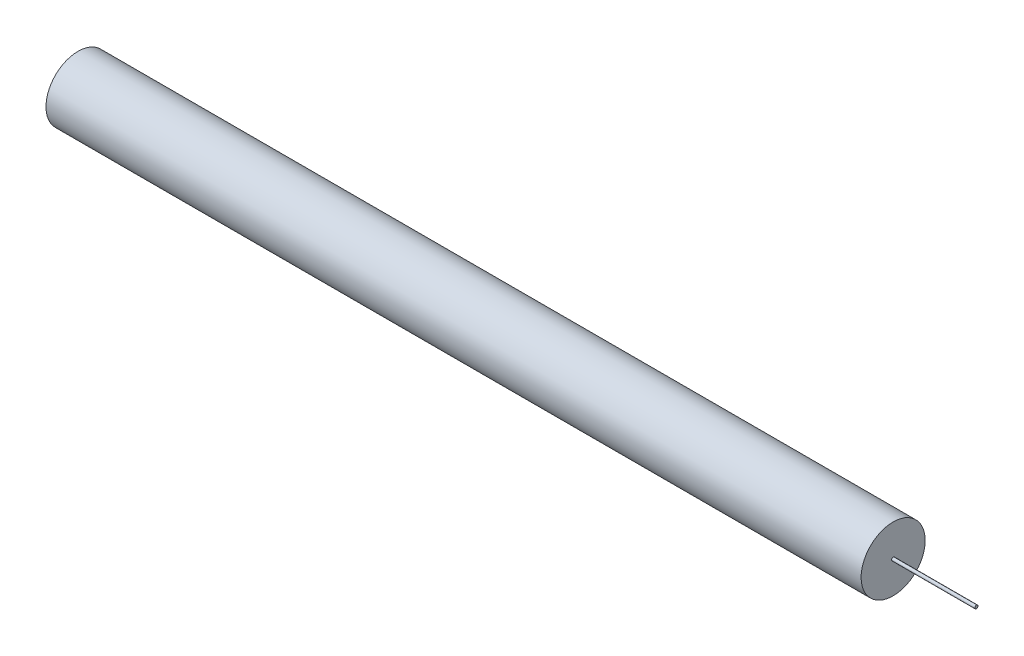
ISO-10303-21;
HEADER;
FILE_DESCRIPTION(('STEP AP214'),'2;1');
FILE_NAME('part.step','',(''),(''),'','','');
FILE_SCHEMA(('AUTOMOTIVE_DESIGN { 1 0 10303 214 1 1 1 1 }'));
ENDSEC;
DATA;
#1=APPLICATION_CONTEXT('core data for automotive mechanical design processes');
#2=APPLICATION_PROTOCOL_DEFINITION('international standard','automotive_design',2000,#1);
#3=PRODUCT_CONTEXT('',#1,'mechanical');
#4=PRODUCT('Part','Part','',(#3));
#5=PRODUCT_RELATED_PRODUCT_CATEGORY('part','',(#4));
#6=PRODUCT_DEFINITION_FORMATION('','',#4);
#7=PRODUCT_DEFINITION_CONTEXT('part definition',#1,'design');
#8=PRODUCT_DEFINITION('design','',#6,#7);
#9=PRODUCT_DEFINITION_SHAPE('','',#8);
#10=(LENGTH_UNIT() NAMED_UNIT(*) SI_UNIT(.MILLI.,.METRE.));
#11=(NAMED_UNIT(*) PLANE_ANGLE_UNIT() SI_UNIT($,.RADIAN.));
#12=(NAMED_UNIT(*) SI_UNIT($,.STERADIAN.) SOLID_ANGLE_UNIT());
#13=UNCERTAINTY_MEASURE_WITH_UNIT(LENGTH_MEASURE(1.E-05),#10,'distance_accuracy_value','');
#14=(GEOMETRIC_REPRESENTATION_CONTEXT(3) GLOBAL_UNCERTAINTY_ASSIGNED_CONTEXT((#13)) GLOBAL_UNIT_ASSIGNED_CONTEXT((#10,
#11,#12)) REPRESENTATION_CONTEXT('',''));
#15=CARTESIAN_POINT('',(0.,0.,0.));
#16=DIRECTION('',(0.,0.,1.));
#17=DIRECTION('',(1.,0.,0.));
#18=AXIS2_PLACEMENT_3D('',#15,#16,#17);
#19=CARTESIAN_POINT('',(0.,0.,0.));
#20=DIRECTION('',(1.,0.,0.));
#21=DIRECTION('',(0.,1.,0.));
#22=AXIS2_PLACEMENT_3D('',#19,#20,#21);
#23=PLANE('',#22);
#24=CARTESIAN_POINT('',(0.,0.,0.));
#25=DIRECTION('',(1.,0.,0.));
#26=DIRECTION('',(0.,1.,0.));
#27=AXIS2_PLACEMENT_3D('',#24,#25,#26);
#28=CIRCLE('',#27,20.);
#29=CARTESIAN_POINT('',(0.,20.,0.));
#30=VERTEX_POINT('',#29);
#31=EDGE_CURVE('E64',#30,#30,#28,.T.);
#32=ORIENTED_EDGE('',*,*,#31,.F.);
#33=EDGE_LOOP('',(#32));
#34=FACE_BOUND('',#33,.T.);
#35=ADVANCED_FACE('F57',(#34),#23,.F.);
#36=CARTESIAN_POINT('',(509.085862196273,0.,0.));
#37=DIRECTION('',(1.,0.,0.));
#38=DIRECTION('',(0.,1.,0.));
#39=AXIS2_PLACEMENT_3D('',#36,#37,#38);
#40=PLANE('',#39);
#41=CARTESIAN_POINT('',(509.085862196273,0.,0.));
#42=DIRECTION('',(-1.,0.,0.));
#43=DIRECTION('',(0.,-1.,0.));
#44=AXIS2_PLACEMENT_3D('',#41,#42,#43);
#45=CIRCLE('',#44,1.);
#46=CARTESIAN_POINT('',(509.085862196273,-0.999999999999996,0.));
#47=VERTEX_POINT('',#46);
#48=EDGE_CURVE('E69',#47,#47,#45,.T.);
#49=ORIENTED_EDGE('',*,*,#48,.T.);
#50=EDGE_LOOP('',(#49));
#51=FACE_BOUND('',#50,.T.);
#52=CARTESIAN_POINT('',(509.085862196273,0.,0.));
#53=DIRECTION('',(1.,0.,0.));
#54=DIRECTION('',(0.,1.,0.));
#55=AXIS2_PLACEMENT_3D('',#52,#53,#54);
#56=CIRCLE('',#55,20.);
#57=CARTESIAN_POINT('',(509.085862196273,19.9999999999999,0.));
#58=VERTEX_POINT('',#57);
#59=EDGE_CURVE('E11',#58,#58,#56,.T.);
#60=ORIENTED_EDGE('',*,*,#59,.T.);
#61=EDGE_LOOP('',(#60));
#62=FACE_BOUND('',#61,.T.);
#63=ADVANCED_FACE('F91',(#51,#62),#40,.T.);
#64=CARTESIAN_POINT('',(0.,0.,0.));
#65=DIRECTION('',(1.,0.,0.));
#66=DIRECTION('',(0.,1.,0.));
#67=AXIS2_PLACEMENT_3D('',#64,#65,#66);
#68=CYLINDRICAL_SURFACE('',#67,20.);
#69=ORIENTED_EDGE('',*,*,#59,.F.);
#70=EDGE_LOOP('',(#69));
#71=FACE_BOUND('',#70,.T.);
#72=ORIENTED_EDGE('',*,*,#31,.T.);
#73=EDGE_LOOP('',(#72));
#74=FACE_BOUND('',#73,.T.);
#75=ADVANCED_FACE('F83',(#71,#74),#68,.T.);
#76=CARTESIAN_POINT('',(561.085862196273,0.,0.));
#77=DIRECTION('',(-1.,0.,0.));
#78=DIRECTION('',(0.,-1.,0.));
#79=AXIS2_PLACEMENT_3D('',#76,#77,#78);
#80=PLANE('',#79);
#81=CARTESIAN_POINT('',(561.085862196273,0.,0.));
#82=DIRECTION('',(-1.,0.,0.));
#83=DIRECTION('',(0.,-1.,0.));
#84=AXIS2_PLACEMENT_3D('',#81,#82,#83);
#85=CIRCLE('',#84,1.);
#86=CARTESIAN_POINT('',(561.085862196273,-1.00000000000007,0.));
#87=VERTEX_POINT('',#86);
#88=EDGE_CURVE('E73',#87,#87,#85,.T.);
#89=ORIENTED_EDGE('',*,*,#88,.F.);
#90=EDGE_LOOP('',(#89));
#91=FACE_BOUND('',#90,.T.);
#92=ADVANCED_FACE('F81',(#91),#80,.F.);
#93=CARTESIAN_POINT('',(561.085862196273,0.,0.));
#94=DIRECTION('',(-1.,0.,0.));
#95=DIRECTION('',(0.,-1.,0.));
#96=AXIS2_PLACEMENT_3D('',#93,#94,#95);
#97=CYLINDRICAL_SURFACE('',#96,1.);
#98=ORIENTED_EDGE('',*,*,#48,.F.);
#99=EDGE_LOOP('',(#98));
#100=FACE_BOUND('',#99,.T.);
#101=ORIENTED_EDGE('',*,*,#88,.T.);
#102=EDGE_LOOP('',(#101));
#103=FACE_BOUND('',#102,.T.);
#104=ADVANCED_FACE('F79',(#100,#103),#97,.T.);
#105=CLOSED_SHELL('',(#35,#63,#75,#92,#104));
#106=MANIFOLD_SOLID_BREP('B2',#105);
#107=ADVANCED_BREP_SHAPE_REPRESENTATION('',(#18,#106),#14);
#108=SHAPE_DEFINITION_REPRESENTATION(#9,#107);
ENDSEC;
END-ISO-10303-21;
